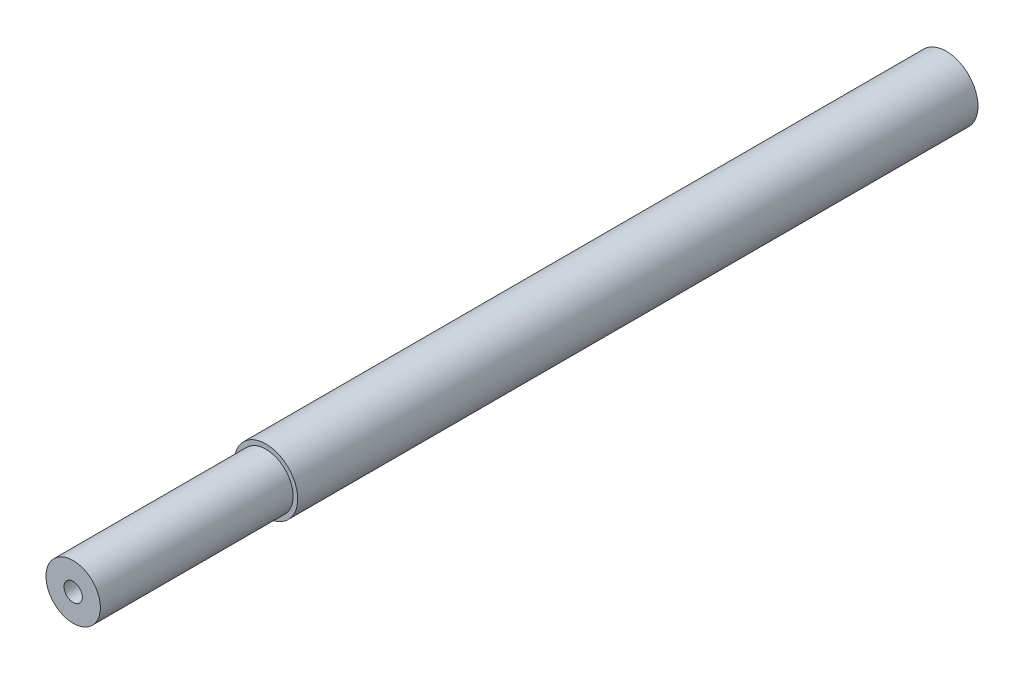
ISO-10303-21;
HEADER;
FILE_DESCRIPTION(('STEP AP214'),'2;1');
FILE_NAME('part.step','',(''),(''),'','','');
FILE_SCHEMA(('AUTOMOTIVE_DESIGN { 1 0 10303 214 1 1 1 1 }'));
ENDSEC;
DATA;
#1=APPLICATION_CONTEXT('core data for automotive mechanical design processes');
#2=APPLICATION_PROTOCOL_DEFINITION('international standard','automotive_design',2000,#1);
#3=PRODUCT_CONTEXT('',#1,'mechanical');
#4=PRODUCT('Part','Part','',(#3));
#5=PRODUCT_RELATED_PRODUCT_CATEGORY('part','',(#4));
#6=PRODUCT_DEFINITION_FORMATION('','',#4);
#7=PRODUCT_DEFINITION_CONTEXT('part definition',#1,'design');
#8=PRODUCT_DEFINITION('design','',#6,#7);
#9=PRODUCT_DEFINITION_SHAPE('','',#8);
#10=(LENGTH_UNIT() NAMED_UNIT(*) SI_UNIT(.MILLI.,.METRE.));
#11=(NAMED_UNIT(*) PLANE_ANGLE_UNIT() SI_UNIT($,.RADIAN.));
#12=(NAMED_UNIT(*) SI_UNIT($,.STERADIAN.) SOLID_ANGLE_UNIT());
#13=UNCERTAINTY_MEASURE_WITH_UNIT(LENGTH_MEASURE(1.E-05),#10,'distance_accuracy_value','');
#14=(GEOMETRIC_REPRESENTATION_CONTEXT(3) GLOBAL_UNCERTAINTY_ASSIGNED_CONTEXT((#13)) GLOBAL_UNIT_ASSIGNED_CONTEXT((#10,
#11,#12)) REPRESENTATION_CONTEXT('',''));
#15=CARTESIAN_POINT('',(0.,0.,0.));
#16=DIRECTION('',(0.,0.,1.));
#17=DIRECTION('',(1.,0.,0.));
#18=AXIS2_PLACEMENT_3D('',#15,#16,#17);
#19=CARTESIAN_POINT('',(0.,0.,-185.));
#20=DIRECTION('',(0.,0.,1.));
#21=DIRECTION('',(1.,0.,0.));
#22=AXIS2_PLACEMENT_3D('',#19,#20,#21);
#23=PLANE('',#22);
#24=CARTESIAN_POINT('',(0.,0.,-185.));
#25=DIRECTION('',(0.,0.,1.));
#26=DIRECTION('',(1.,0.,0.));
#27=AXIS2_PLACEMENT_3D('',#24,#25,#26);
#28=CIRCLE('',#27,7.);
#29=CARTESIAN_POINT('',(7.,0.,-185.));
#30=VERTEX_POINT('',#29);
#31=EDGE_CURVE('E10',#30,#30,#28,.T.);
#32=ORIENTED_EDGE('',*,*,#31,.F.);
#33=EDGE_LOOP('',(#32));
#34=FACE_BOUND('',#33,.T.);
#35=ADVANCED_FACE('F37',(#34),#23,.F.);
#36=CARTESIAN_POINT('',(0.,0.,0.));
#37=DIRECTION('',(0.,0.,1.));
#38=DIRECTION('',(1.,0.,0.));
#39=AXIS2_PLACEMENT_3D('',#36,#37,#38);
#40=CYLINDRICAL_SURFACE('',#39,7.);
#41=CARTESIAN_POINT('',(0.,0.,-35.));
#42=DIRECTION('',(0.,0.,1.));
#43=DIRECTION('',(1.,0.,0.));
#44=AXIS2_PLACEMENT_3D('',#41,#42,#43);
#45=CIRCLE('',#44,7.);
#46=CARTESIAN_POINT('',(7.,0.,-35.));
#47=VERTEX_POINT('',#46);
#48=EDGE_CURVE('E43',#47,#47,#45,.T.);
#49=ORIENTED_EDGE('',*,*,#48,.F.);
#50=EDGE_LOOP('',(#49));
#51=FACE_BOUND('',#50,.T.);
#52=ORIENTED_EDGE('',*,*,#31,.T.);
#53=EDGE_LOOP('',(#52));
#54=FACE_BOUND('',#53,.T.);
#55=ADVANCED_FACE('F85',(#51,#54),#40,.T.);
#56=CARTESIAN_POINT('',(0.,6.,-35.));
#57=DIRECTION('',(0.,0.,-1.));
#58=DIRECTION('',(-1.,0.,0.));
#59=AXIS2_PLACEMENT_3D('',#56,#57,#58);
#60=PLANE('',#59);
#61=CARTESIAN_POINT('',(0.,0.,-35.));
#62=DIRECTION('',(0.,0.,1.));
#63=DIRECTION('',(1.,0.,0.));
#64=AXIS2_PLACEMENT_3D('',#61,#62,#63);
#65=CIRCLE('',#64,6.);
#66=CARTESIAN_POINT('',(6.,0.,-35.));
#67=VERTEX_POINT('',#66);
#68=EDGE_CURVE('E47',#67,#67,#65,.T.);
#69=ORIENTED_EDGE('',*,*,#68,.F.);
#70=EDGE_LOOP('',(#69));
#71=FACE_BOUND('',#70,.T.);
#72=ORIENTED_EDGE('',*,*,#48,.T.);
#73=EDGE_LOOP('',(#72));
#74=FACE_BOUND('',#73,.T.);
#75=ADVANCED_FACE('F80',(#71,#74),#60,.F.);
#76=CARTESIAN_POINT('',(0.,0.,0.));
#77=DIRECTION('',(0.,0.,1.));
#78=DIRECTION('',(1.,0.,0.));
#79=AXIS2_PLACEMENT_3D('',#76,#77,#78);
#80=CYLINDRICAL_SURFACE('',#79,6.);
#81=CARTESIAN_POINT('',(0.,0.,7.5));
#82=DIRECTION('',(0.,0.,1.));
#83=DIRECTION('',(1.,0.,0.));
#84=AXIS2_PLACEMENT_3D('',#81,#82,#83);
#85=CIRCLE('',#84,6.);
#86=CARTESIAN_POINT('',(6.,0.,7.5));
#87=VERTEX_POINT('',#86);
#88=EDGE_CURVE('E51',#87,#87,#85,.T.);
#89=ORIENTED_EDGE('',*,*,#88,.F.);
#90=EDGE_LOOP('',(#89));
#91=FACE_BOUND('',#90,.T.);
#92=ORIENTED_EDGE('',*,*,#68,.T.);
#93=EDGE_LOOP('',(#92));
#94=FACE_BOUND('',#93,.T.);
#95=ADVANCED_FACE('F74',(#91,#94),#80,.T.);
#96=CARTESIAN_POINT('',(0.,6.,7.5));
#97=DIRECTION('',(0.,0.,-1.));
#98=DIRECTION('',(-1.,0.,0.));
#99=AXIS2_PLACEMENT_3D('',#96,#97,#98);
#100=PLANE('',#99);
#101=CARTESIAN_POINT('',(0.,0.,7.5));
#102=DIRECTION('',(0.,0.,1.));
#103=DIRECTION('',(1.,0.,0.));
#104=AXIS2_PLACEMENT_3D('',#101,#102,#103);
#105=CIRCLE('',#104,2.0193);
#106=CARTESIAN_POINT('',(2.0193,0.,7.5));
#107=VERTEX_POINT('',#106);
#108=EDGE_CURVE('E57',#107,#107,#105,.T.);
#109=ORIENTED_EDGE('',*,*,#108,.F.);
#110=EDGE_LOOP('',(#109));
#111=FACE_BOUND('',#110,.T.);
#112=ORIENTED_EDGE('',*,*,#88,.T.);
#113=EDGE_LOOP('',(#112));
#114=FACE_BOUND('',#113,.T.);
#115=ADVANCED_FACE('F68',(#111,#114),#100,.F.);
#116=CARTESIAN_POINT('',(0.,0.,-17.5));
#117=DIRECTION('',(0.,0.,1.));
#118=DIRECTION('',(1.,0.,0.));
#119=AXIS2_PLACEMENT_3D('',#116,#117,#118);
#120=CYLINDRICAL_SURFACE('',#119,2.0193);
#121=CARTESIAN_POINT('',(0.,0.,-17.5));
#122=DIRECTION('',(0.,0.,1.));
#123=DIRECTION('',(1.,0.,0.));
#124=AXIS2_PLACEMENT_3D('',#121,#122,#123);
#125=CIRCLE('',#124,2.0193);
#126=CARTESIAN_POINT('',(2.0193,0.,-17.5));
#127=VERTEX_POINT('',#126);
#128=EDGE_CURVE('E56',#127,#127,#125,.T.);
#129=ORIENTED_EDGE('',*,*,#128,.F.);
#130=EDGE_LOOP('',(#129));
#131=FACE_BOUND('',#130,.T.);
#132=ORIENTED_EDGE('',*,*,#108,.T.);
#133=EDGE_LOOP('',(#132));
#134=FACE_BOUND('',#133,.T.);
#135=ADVANCED_FACE('F65',(#131,#134),#120,.F.);
#136=CARTESIAN_POINT('',(0.,0.,-17.5));
#137=DIRECTION('',(0.,0.,1.));
#138=DIRECTION('',(1.,0.,0.));
#139=AXIS2_PLACEMENT_3D('',#136,#137,#138);
#140=PLANE('',#139);
#141=ORIENTED_EDGE('',*,*,#128,.T.);
#142=EDGE_LOOP('',(#141));
#143=FACE_BOUND('',#142,.T.);
#144=ADVANCED_FACE('F63',(#143),#140,.T.);
#145=CLOSED_SHELL('',(#35,#55,#75,#95,#115,#135,#144));
#146=MANIFOLD_SOLID_BREP('B2',#145);
#147=ADVANCED_BREP_SHAPE_REPRESENTATION('',(#18,#146),#14);
#148=SHAPE_DEFINITION_REPRESENTATION(#9,#147);
ENDSEC;
END-ISO-10303-21;
